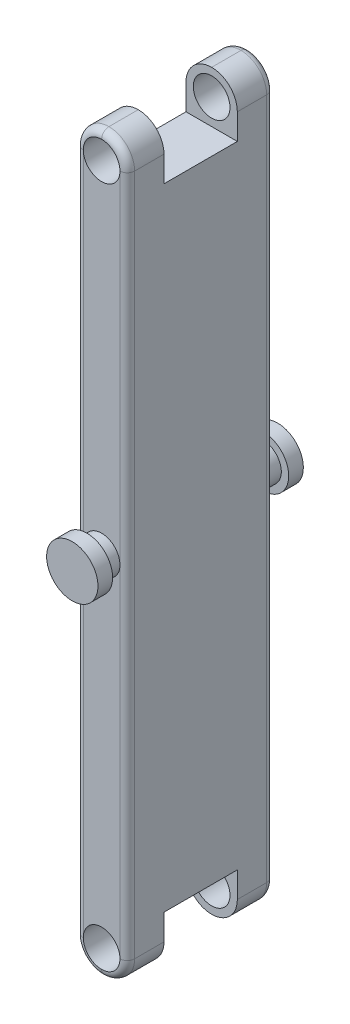
ISO-10303-21;
HEADER;
FILE_DESCRIPTION(('STEP AP214'),'2;1');
FILE_NAME('part.step','',(''),(''),'','','');
FILE_SCHEMA(('AUTOMOTIVE_DESIGN { 1 0 10303 214 1 1 1 1 }'));
ENDSEC;
DATA;
#1=APPLICATION_CONTEXT('core data for automotive mechanical design processes');
#2=APPLICATION_PROTOCOL_DEFINITION('international standard','automotive_design',2000,#1);
#3=PRODUCT_CONTEXT('',#1,'mechanical');
#4=PRODUCT('Part','Part','',(#3));
#5=PRODUCT_RELATED_PRODUCT_CATEGORY('part','',(#4));
#6=PRODUCT_DEFINITION_FORMATION('','',#4);
#7=PRODUCT_DEFINITION_CONTEXT('part definition',#1,'design');
#8=PRODUCT_DEFINITION('design','',#6,#7);
#9=PRODUCT_DEFINITION_SHAPE('','',#8);
#10=(LENGTH_UNIT() NAMED_UNIT(*) SI_UNIT(.MILLI.,.METRE.));
#11=(NAMED_UNIT(*) PLANE_ANGLE_UNIT() SI_UNIT($,.RADIAN.));
#12=(NAMED_UNIT(*) SI_UNIT($,.STERADIAN.) SOLID_ANGLE_UNIT());
#13=UNCERTAINTY_MEASURE_WITH_UNIT(LENGTH_MEASURE(1.E-05),#10,'distance_accuracy_value','');
#14=(GEOMETRIC_REPRESENTATION_CONTEXT(3) GLOBAL_UNCERTAINTY_ASSIGNED_CONTEXT((#13)) GLOBAL_UNIT_ASSIGNED_CONTEXT((#10,
#11,#12)) REPRESENTATION_CONTEXT('',''));
#15=CARTESIAN_POINT('',(0.,0.,0.));
#16=DIRECTION('',(0.,0.,1.));
#17=DIRECTION('',(1.,0.,0.));
#18=AXIS2_PLACEMENT_3D('',#15,#16,#17);
#19=CARTESIAN_POINT('',(0.,200.,20.));
#20=DIRECTION('',(0.,0.,-1.));
#21=DIRECTION('',(-1.,0.,0.));
#22=AXIS2_PLACEMENT_3D('',#19,#20,#21);
#23=PLANE('',#22);
#24=CARTESIAN_POINT('',(7.00000000000001,193.,20.));
#25=DIRECTION('',(0.,0.,-1.));
#26=DIRECTION('',(-1.,0.,0.));
#27=AXIS2_PLACEMENT_3D('',#24,#25,#26);
#28=CIRCLE('',#27,5.);
#29=CARTESIAN_POINT('',(12.,193.,20.));
#30=VERTEX_POINT('',#29);
#31=CARTESIAN_POINT('',(2.00000000000001,193.,20.));
#32=VERTEX_POINT('',#31);
#33=EDGE_CURVE('E253',#30,#32,#28,.T.);
#34=ORIENTED_EDGE('',*,*,#33,.T.);
#35=DIRECTION('',(0.,-1.,0.));
#36=VECTOR('',#35,1.);
#37=CARTESIAN_POINT('',(2.00000000000001,200.,20.));
#38=LINE('',#37,#36);
#39=CARTESIAN_POINT('',(2.00000000000001,100.,20.));
#40=VERTEX_POINT('',#39);
#41=EDGE_CURVE('E367',#32,#40,#38,.T.);
#42=ORIENTED_EDGE('',*,*,#41,.T.);
#43=CARTESIAN_POINT('',(7.00000000000001,100.,20.));
#44=DIRECTION('',(0.,0.,-1.));
#45=DIRECTION('',(-1.,0.,0.));
#46=AXIS2_PLACEMENT_3D('',#43,#44,#45);
#47=CIRCLE('',#46,5.);
#48=CARTESIAN_POINT('',(12.,100.,20.));
#49=VERTEX_POINT('',#48);
#50=EDGE_CURVE('E325',#49,#40,#47,.F.);
#51=ORIENTED_EDGE('',*,*,#50,.F.);
#52=DIRECTION('',(0.,-1.,0.));
#53=VECTOR('',#52,1.);
#54=CARTESIAN_POINT('',(12.,200.,20.));
#55=LINE('',#54,#53);
#56=EDGE_CURVE('E361',#49,#30,#55,.F.);
#57=ORIENTED_EDGE('',*,*,#56,.T.);
#58=EDGE_LOOP('',(#34,#42,#51,#57));
#59=FACE_BOUND('',#58,.T.);
#60=ADVANCED_FACE('F37',(#59),#23,.F.);
#61=CARTESIAN_POINT('',(0.,200.,-20.));
#62=DIRECTION('',(0.,0.,-1.));
#63=DIRECTION('',(-1.,0.,0.));
#64=AXIS2_PLACEMENT_3D('',#61,#62,#63);
#65=PLANE('',#64);
#66=CARTESIAN_POINT('',(7.,7.,-20.));
#67=DIRECTION('',(0.,0.,-1.));
#68=DIRECTION('',(-1.,0.,0.));
#69=AXIS2_PLACEMENT_3D('',#66,#67,#68);
#70=CIRCLE('',#69,5.);
#71=CARTESIAN_POINT('',(1.99999999999999,7.,-20.));
#72=VERTEX_POINT('',#71);
#73=CARTESIAN_POINT('',(12.,7.,-20.));
#74=VERTEX_POINT('',#73);
#75=EDGE_CURVE('E231',#72,#74,#70,.T.);
#76=ORIENTED_EDGE('',*,*,#75,.F.);
#77=DIRECTION('',(0.,-1.,0.));
#78=VECTOR('',#77,1.);
#79=CARTESIAN_POINT('',(1.99999999999999,193.,-20.));
#80=LINE('',#79,#78);
#81=CARTESIAN_POINT('',(1.99999999999999,100.,-20.));
#82=VERTEX_POINT('',#81);
#83=EDGE_CURVE('E350',#72,#82,#80,.F.);
#84=ORIENTED_EDGE('',*,*,#83,.T.);
#85=CARTESIAN_POINT('',(7.00000000000001,100.,-20.));
#86=DIRECTION('',(0.,0.,-1.));
#87=DIRECTION('',(-1.,0.,0.));
#88=AXIS2_PLACEMENT_3D('',#85,#86,#87);
#89=CIRCLE('',#88,5.);
#90=CARTESIAN_POINT('',(12.,100.,-20.));
#91=VERTEX_POINT('',#90);
#92=EDGE_CURVE('E340',#91,#82,#89,.T.);
#93=ORIENTED_EDGE('',*,*,#92,.F.);
#94=DIRECTION('',(0.,-1.,0.));
#95=VECTOR('',#94,1.);
#96=CARTESIAN_POINT('',(12.,7.00000000000001,-20.));
#97=LINE('',#96,#95);
#98=EDGE_CURVE('E344',#91,#74,#97,.T.);
#99=ORIENTED_EDGE('',*,*,#98,.T.);
#100=EDGE_LOOP('',(#76,#84,#93,#99));
#101=FACE_BOUND('',#100,.T.);
#102=ADVANCED_FACE('F497',(#101),#65,.T.);
#103=EDGE_CURVE('E337',#40,#49,#47,.F.);
#104=ORIENTED_EDGE('',*,*,#103,.F.);
#105=DIRECTION('',(0.,-1.,0.));
#106=VECTOR('',#105,1.);
#107=CARTESIAN_POINT('',(2.00000000000001,200.,20.));
#108=LINE('',#107,#106);
#109=CARTESIAN_POINT('',(2.00000000000001,7.,20.));
#110=VERTEX_POINT('',#109);
#111=EDGE_CURVE('E365',#40,#110,#108,.T.);
#112=ORIENTED_EDGE('',*,*,#111,.T.);
#113=CARTESIAN_POINT('',(7.,7.,20.));
#114=DIRECTION('',(0.,0.,-1.));
#115=DIRECTION('',(-1.,0.,0.));
#116=AXIS2_PLACEMENT_3D('',#113,#114,#115);
#117=CIRCLE('',#116,5.);
#118=CARTESIAN_POINT('',(12.,7.,20.));
#119=VERTEX_POINT('',#118);
#120=EDGE_CURVE('E262',#110,#119,#117,.T.);
#121=ORIENTED_EDGE('',*,*,#120,.T.);
#122=DIRECTION('',(0.,-1.,0.));
#123=VECTOR('',#122,1.);
#124=CARTESIAN_POINT('',(12.,200.,20.));
#125=LINE('',#124,#123);
#126=EDGE_CURVE('E363',#119,#49,#125,.F.);
#127=ORIENTED_EDGE('',*,*,#126,.T.);
#128=EDGE_LOOP('',(#104,#112,#121,#127));
#129=FACE_BOUND('',#128,.T.);
#130=ADVANCED_FACE('F500',(#129),#23,.F.);
#131=EDGE_CURVE('E341',#82,#91,#89,.T.);
#132=ORIENTED_EDGE('',*,*,#131,.F.);
#133=DIRECTION('',(0.,-1.,0.));
#134=VECTOR('',#133,1.);
#135=CARTESIAN_POINT('',(1.99999999999999,193.,-20.));
#136=LINE('',#135,#134);
#137=CARTESIAN_POINT('',(1.99999999999999,193.,-20.));
#138=VERTEX_POINT('',#137);
#139=EDGE_CURVE('E348',#82,#138,#136,.F.);
#140=ORIENTED_EDGE('',*,*,#139,.T.);
#141=CARTESIAN_POINT('',(7.00000000000001,193.,-20.));
#142=DIRECTION('',(0.,0.,-1.));
#143=DIRECTION('',(-1.,0.,0.));
#144=AXIS2_PLACEMENT_3D('',#141,#142,#143);
#145=CIRCLE('',#144,5.);
#146=CARTESIAN_POINT('',(12.,193.,-20.));
#147=VERTEX_POINT('',#146);
#148=EDGE_CURVE('E467',#147,#138,#145,.T.);
#149=ORIENTED_EDGE('',*,*,#148,.F.);
#150=DIRECTION('',(0.,-1.,0.));
#151=VECTOR('',#150,1.);
#152=CARTESIAN_POINT('',(12.,7.00000000000001,-20.));
#153=LINE('',#152,#151);
#154=EDGE_CURVE('E346',#147,#91,#153,.T.);
#155=ORIENTED_EDGE('',*,*,#154,.T.);
#156=EDGE_LOOP('',(#132,#140,#149,#155));
#157=FACE_BOUND('',#156,.T.);
#158=ADVANCED_FACE('F469',(#157),#65,.T.);
#159=CARTESIAN_POINT('',(0.,186.,-10.));
#160=DIRECTION('',(0.,0.,1.));
#161=DIRECTION('',(1.,0.,0.));
#162=AXIS2_PLACEMENT_3D('',#159,#160,#161);
#163=PLANE('',#162);
#164=CARTESIAN_POINT('',(7.,193.,-10.));
#165=DIRECTION('',(0.,0.,1.));
#166=DIRECTION('',(1.,0.,0.));
#167=AXIS2_PLACEMENT_3D('',#164,#165,#166);
#168=CIRCLE('',#167,7.);
#169=CARTESIAN_POINT('',(14.,193.,-10.));
#170=VERTEX_POINT('',#169);
#171=CARTESIAN_POINT('',(7.,200.,-10.));
#172=VERTEX_POINT('',#171);
#173=EDGE_CURVE('E312',#170,#172,#168,.T.);
#174=ORIENTED_EDGE('',*,*,#173,.T.);
#175=CARTESIAN_POINT('',(6.99999999999999,193.,-10.));
#176=DIRECTION('',(0.,0.,1.));
#177=DIRECTION('',(1.,0.,0.));
#178=AXIS2_PLACEMENT_3D('',#175,#176,#177);
#179=CIRCLE('',#178,7.);
#180=CARTESIAN_POINT('',(0.,193.,-10.));
#181=VERTEX_POINT('',#180);
#182=EDGE_CURVE('E314',#172,#181,#179,.T.);
#183=ORIENTED_EDGE('',*,*,#182,.T.);
#184=DIRECTION('',(0.,1.,0.));
#185=VECTOR('',#184,1.);
#186=CARTESIAN_POINT('',(0.,186.,-10.));
#187=LINE('',#186,#185);
#188=CARTESIAN_POINT('',(0.,186.,-10.));
#189=VERTEX_POINT('',#188);
#190=EDGE_CURVE('E220',#189,#181,#187,.T.);
#191=ORIENTED_EDGE('',*,*,#190,.F.);
#192=DIRECTION('',(1.,0.,0.));
#193=VECTOR('',#192,1.);
#194=CARTESIAN_POINT('',(0.,186.,-10.));
#195=LINE('',#194,#193);
#196=CARTESIAN_POINT('',(14.,186.,-10.));
#197=VERTEX_POINT('',#196);
#198=EDGE_CURVE('E206',#189,#197,#195,.T.);
#199=ORIENTED_EDGE('',*,*,#198,.T.);
#200=DIRECTION('',(0.,1.,0.));
#201=VECTOR('',#200,1.);
#202=CARTESIAN_POINT('',(14.,186.,-10.));
#203=LINE('',#202,#201);
#204=EDGE_CURVE('E217',#197,#170,#203,.T.);
#205=ORIENTED_EDGE('',*,*,#204,.T.);
#206=EDGE_LOOP('',(#174,#183,#191,#199,#205));
#207=FACE_BOUND('',#206,.T.);
#208=CARTESIAN_POINT('',(7.00000000000001,193.,-10.));
#209=DIRECTION('',(0.,0.,-1.));
#210=DIRECTION('',(-1.,0.,0.));
#211=AXIS2_PLACEMENT_3D('',#208,#209,#210);
#212=CIRCLE('',#211,5.);
#213=CARTESIAN_POINT('',(2.00000000000001,193.,-10.));
#214=VERTEX_POINT('',#213);
#215=EDGE_CURVE('E328',#214,#214,#212,.T.);
#216=ORIENTED_EDGE('',*,*,#215,.T.);
#217=EDGE_LOOP('',(#216));
#218=FACE_BOUND('',#217,.T.);
#219=ADVANCED_FACE('F215',(#207,#218),#163,.T.);
#220=CARTESIAN_POINT('',(0.,200.,0.));
#221=DIRECTION('',(1.,0.,0.));
#222=DIRECTION('',(0.,0.,-1.));
#223=AXIS2_PLACEMENT_3D('',#220,#221,#222);
#224=PLANE('',#223);
#225=DIRECTION('',(0.,0.,-1.));
#226=VECTOR('',#225,1.);
#227=CARTESIAN_POINT('',(0.,193.,-20.));
#228=LINE('',#227,#226);
#229=CARTESIAN_POINT('',(0.,193.,-18.));
#230=VERTEX_POINT('',#229);
#231=EDGE_CURVE('E295',#181,#230,#228,.T.);
#232=ORIENTED_EDGE('',*,*,#231,.T.);
#233=DIRECTION('',(0.,-1.,0.));
#234=VECTOR('',#233,1.);
#235=CARTESIAN_POINT('',(0.,7.00000000000001,-18.));
#236=LINE('',#235,#234);
#237=CARTESIAN_POINT('',(0.,7.00000000000001,-18.));
#238=VERTEX_POINT('',#237);
#239=EDGE_CURVE('E379',#230,#238,#236,.T.);
#240=ORIENTED_EDGE('',*,*,#239,.T.);
#241=DIRECTION('',(0.,0.,-1.));
#242=VECTOR('',#241,1.);
#243=CARTESIAN_POINT('',(0.,7.00000000000001,0.));
#244=LINE('',#243,#242);
#245=CARTESIAN_POINT('',(0.,7.,-10.));
#246=VERTEX_POINT('',#245);
#247=EDGE_CURVE('E293',#238,#246,#244,.F.);
#248=ORIENTED_EDGE('',*,*,#247,.T.);
#249=DIRECTION('',(0.,-1.,0.));
#250=VECTOR('',#249,1.);
#251=CARTESIAN_POINT('',(0.,14.,-10.));
#252=LINE('',#251,#250);
#253=CARTESIAN_POINT('',(0.,14.,-10.));
#254=VERTEX_POINT('',#253);
#255=EDGE_CURVE('E241',#254,#246,#252,.T.);
#256=ORIENTED_EDGE('',*,*,#255,.F.);
#257=DIRECTION('',(0.,0.,-1.));
#258=VECTOR('',#257,1.);
#259=CARTESIAN_POINT('',(0.,14.,0.));
#260=LINE('',#259,#258);
#261=CARTESIAN_POINT('',(0.,14.,10.));
#262=VERTEX_POINT('',#261);
#263=EDGE_CURVE('E265',#262,#254,#260,.T.);
#264=ORIENTED_EDGE('',*,*,#263,.F.);
#265=DIRECTION('',(0.,-1.,0.));
#266=VECTOR('',#265,1.);
#267=CARTESIAN_POINT('',(0.,14.,10.));
#268=LINE('',#267,#266);
#269=CARTESIAN_POINT('',(0.,7.00000000000001,10.));
#270=VERTEX_POINT('',#269);
#271=EDGE_CURVE('E275',#262,#270,#268,.T.);
#272=ORIENTED_EDGE('',*,*,#271,.T.);
#273=DIRECTION('',(0.,0.,1.));
#274=VECTOR('',#273,1.);
#275=CARTESIAN_POINT('',(0.,7.00000000000001,0.));
#276=LINE('',#275,#274);
#277=CARTESIAN_POINT('',(0.,7.00000000000001,18.));
#278=VERTEX_POINT('',#277);
#279=EDGE_CURVE('E278',#270,#278,#276,.T.);
#280=ORIENTED_EDGE('',*,*,#279,.T.);
#281=DIRECTION('',(0.,-1.,0.));
#282=VECTOR('',#281,1.);
#283=CARTESIAN_POINT('',(0.,200.,18.));
#284=LINE('',#283,#282);
#285=CARTESIAN_POINT('',(0.,193.,18.));
#286=VERTEX_POINT('',#285);
#287=EDGE_CURVE('E377',#278,#286,#284,.F.);
#288=ORIENTED_EDGE('',*,*,#287,.T.);
#289=DIRECTION('',(0.,0.,1.));
#290=VECTOR('',#289,1.);
#291=CARTESIAN_POINT('',(0.,193.,10.));
#292=LINE('',#291,#290);
#293=CARTESIAN_POINT('',(0.,193.,10.));
#294=VERTEX_POINT('',#293);
#295=EDGE_CURVE('E298',#286,#294,#292,.F.);
#296=ORIENTED_EDGE('',*,*,#295,.T.);
#297=DIRECTION('',(0.,1.,0.));
#298=VECTOR('',#297,1.);
#299=CARTESIAN_POINT('',(0.,186.,10.));
#300=LINE('',#299,#298);
#301=CARTESIAN_POINT('',(0.,186.,10.));
#302=VERTEX_POINT('',#301);
#303=EDGE_CURVE('E211',#302,#294,#300,.T.);
#304=ORIENTED_EDGE('',*,*,#303,.F.);
#305=DIRECTION('',(0.,0.,1.));
#306=VECTOR('',#305,1.);
#307=CARTESIAN_POINT('',(0.,186.,0.));
#308=LINE('',#307,#306);
#309=EDGE_CURVE('E251',#189,#302,#308,.T.);
#310=ORIENTED_EDGE('',*,*,#309,.F.);
#311=ORIENTED_EDGE('',*,*,#190,.T.);
#312=EDGE_LOOP('',(#232,#240,#248,#256,#264,#272,#280,#288,#296,#304,#310,#311));
#313=FACE_BOUND('',#312,.T.);
#314=ADVANCED_FACE('F429',(#313),#224,.F.);
#315=CARTESIAN_POINT('',(14.,200.,0.));
#316=DIRECTION('',(-1.,0.,0.));
#317=DIRECTION('',(0.,0.,1.));
#318=AXIS2_PLACEMENT_3D('',#315,#316,#317);
#319=PLANE('',#318);
#320=DIRECTION('',(0.,0.,1.));
#321=VECTOR('',#320,1.);
#322=CARTESIAN_POINT('',(14.,7.00000000000001,0.));
#323=LINE('',#322,#321);
#324=CARTESIAN_POINT('',(14.,7.,-10.));
#325=VERTEX_POINT('',#324);
#326=CARTESIAN_POINT('',(14.,7.00000000000001,-18.));
#327=VERTEX_POINT('',#326);
#328=EDGE_CURVE('E307',#325,#327,#323,.F.);
#329=ORIENTED_EDGE('',*,*,#328,.T.);
#330=DIRECTION('',(0.,-1.,0.));
#331=VECTOR('',#330,1.);
#332=CARTESIAN_POINT('',(14.,193.,-18.));
#333=LINE('',#332,#331);
#334=CARTESIAN_POINT('',(14.,193.,-18.));
#335=VERTEX_POINT('',#334);
#336=EDGE_CURVE('E11',#327,#335,#333,.F.);
#337=ORIENTED_EDGE('',*,*,#336,.T.);
#338=DIRECTION('',(0.,0.,1.));
#339=VECTOR('',#338,1.);
#340=CARTESIAN_POINT('',(14.,193.,-10.));
#341=LINE('',#340,#339);
#342=EDGE_CURVE('E226',#335,#170,#341,.T.);
#343=ORIENTED_EDGE('',*,*,#342,.T.);
#344=ORIENTED_EDGE('',*,*,#204,.F.);
#345=DIRECTION('',(0.,0.,-1.));
#346=VECTOR('',#345,1.);
#347=CARTESIAN_POINT('',(14.,186.,0.));
#348=LINE('',#347,#346);
#349=CARTESIAN_POINT('',(14.,186.,10.));
#350=VERTEX_POINT('',#349);
#351=EDGE_CURVE('E202',#350,#197,#348,.T.);
#352=ORIENTED_EDGE('',*,*,#351,.F.);
#353=DIRECTION('',(0.,1.,0.));
#354=VECTOR('',#353,1.);
#355=CARTESIAN_POINT('',(14.,186.,10.));
#356=LINE('',#355,#354);
#357=CARTESIAN_POINT('',(14.,193.,10.));
#358=VERTEX_POINT('',#357);
#359=EDGE_CURVE('E257',#350,#358,#356,.T.);
#360=ORIENTED_EDGE('',*,*,#359,.T.);
#361=DIRECTION('',(0.,0.,-1.));
#362=VECTOR('',#361,1.);
#363=CARTESIAN_POINT('',(14.,193.,20.));
#364=LINE('',#363,#362);
#365=CARTESIAN_POINT('',(14.,193.,18.));
#366=VERTEX_POINT('',#365);
#367=EDGE_CURVE('E310',#358,#366,#364,.F.);
#368=ORIENTED_EDGE('',*,*,#367,.T.);
#369=DIRECTION('',(0.,-1.,0.));
#370=VECTOR('',#369,1.);
#371=CARTESIAN_POINT('',(14.,200.,18.));
#372=LINE('',#371,#370);
#373=CARTESIAN_POINT('',(14.,7.00000000000001,18.));
#374=VERTEX_POINT('',#373);
#375=EDGE_CURVE('E46',#366,#374,#372,.T.);
#376=ORIENTED_EDGE('',*,*,#375,.T.);
#377=DIRECTION('',(0.,0.,-1.));
#378=VECTOR('',#377,1.);
#379=CARTESIAN_POINT('',(14.,7.00000000000001,0.));
#380=LINE('',#379,#378);
#381=CARTESIAN_POINT('',(14.,7.00000000000001,10.));
#382=VERTEX_POINT('',#381);
#383=EDGE_CURVE('E305',#374,#382,#380,.T.);
#384=ORIENTED_EDGE('',*,*,#383,.T.);
#385=DIRECTION('',(0.,-1.,0.));
#386=VECTOR('',#385,1.);
#387=CARTESIAN_POINT('',(14.,14.,10.));
#388=LINE('',#387,#386);
#389=CARTESIAN_POINT('',(14.,14.,10.));
#390=VERTEX_POINT('',#389);
#391=EDGE_CURVE('E273',#390,#382,#388,.T.);
#392=ORIENTED_EDGE('',*,*,#391,.F.);
#393=DIRECTION('',(0.,0.,1.));
#394=VECTOR('',#393,1.);
#395=CARTESIAN_POINT('',(14.,14.,0.));
#396=LINE('',#395,#394);
#397=CARTESIAN_POINT('',(14.,14.,-10.));
#398=VERTEX_POINT('',#397);
#399=EDGE_CURVE('E274',#398,#390,#396,.T.);
#400=ORIENTED_EDGE('',*,*,#399,.F.);
#401=DIRECTION('',(0.,-1.,0.));
#402=VECTOR('',#401,1.);
#403=CARTESIAN_POINT('',(14.,14.,-10.));
#404=LINE('',#403,#402);
#405=EDGE_CURVE('E242',#398,#325,#404,.T.);
#406=ORIENTED_EDGE('',*,*,#405,.T.);
#407=EDGE_LOOP('',(#329,#337,#343,#344,#352,#360,#368,#376,#384,#392,#400,#406));
#408=FACE_BOUND('',#407,.T.);
#409=ADVANCED_FACE('F224',(#408),#319,.F.);
#410=CARTESIAN_POINT('',(0.,14.,-10.));
#411=DIRECTION('',(0.,0.,1.));
#412=DIRECTION('',(1.,0.,0.));
#413=AXIS2_PLACEMENT_3D('',#410,#411,#412);
#414=PLANE('',#413);
#415=ORIENTED_EDGE('',*,*,#255,.T.);
#416=CARTESIAN_POINT('',(6.99999999999999,7.,-10.));
#417=DIRECTION('',(0.,0.,1.));
#418=DIRECTION('',(1.,0.,0.));
#419=AXIS2_PLACEMENT_3D('',#416,#417,#418);
#420=CIRCLE('',#419,7.);
#421=CARTESIAN_POINT('',(7.,0.,-10.));
#422=VERTEX_POINT('',#421);
#423=EDGE_CURVE('E318',#246,#422,#420,.T.);
#424=ORIENTED_EDGE('',*,*,#423,.T.);
#425=CARTESIAN_POINT('',(7.,7.,-10.));
#426=DIRECTION('',(0.,0.,1.));
#427=DIRECTION('',(1.,0.,0.));
#428=AXIS2_PLACEMENT_3D('',#425,#426,#427);
#429=CIRCLE('',#428,7.);
#430=EDGE_CURVE('E316',#422,#325,#429,.T.);
#431=ORIENTED_EDGE('',*,*,#430,.T.);
#432=ORIENTED_EDGE('',*,*,#405,.F.);
#433=DIRECTION('',(-1.,0.,0.));
#434=VECTOR('',#433,1.);
#435=CARTESIAN_POINT('',(0.,14.,-10.));
#436=LINE('',#435,#434);
#437=EDGE_CURVE('E234',#398,#254,#436,.T.);
#438=ORIENTED_EDGE('',*,*,#437,.T.);
#439=EDGE_LOOP('',(#415,#424,#431,#432,#438));
#440=FACE_BOUND('',#439,.T.);
#441=CARTESIAN_POINT('',(7.00000000000001,7.,-10.));
#442=DIRECTION('',(0.,0.,-1.));
#443=DIRECTION('',(-1.,0.,0.));
#444=AXIS2_PLACEMENT_3D('',#441,#442,#443);
#445=CIRCLE('',#444,5.);
#446=CARTESIAN_POINT('',(2.00000000000001,7.,-10.));
#447=VERTEX_POINT('',#446);
#448=EDGE_CURVE('E228',#447,#447,#445,.T.);
#449=ORIENTED_EDGE('',*,*,#448,.T.);
#450=EDGE_LOOP('',(#449));
#451=FACE_BOUND('',#450,.T.);
#452=ADVANCED_FACE('F557',(#440,#451),#414,.T.);
#453=CARTESIAN_POINT('',(0.,14.,10.));
#454=DIRECTION('',(0.,0.,1.));
#455=DIRECTION('',(1.,0.,0.));
#456=AXIS2_PLACEMENT_3D('',#453,#454,#455);
#457=PLANE('',#456);
#458=CARTESIAN_POINT('',(7.00000000000001,7.,10.));
#459=DIRECTION('',(0.,0.,-1.));
#460=DIRECTION('',(-1.,0.,0.));
#461=AXIS2_PLACEMENT_3D('',#458,#459,#460);
#462=CIRCLE('',#461,5.);
#463=CARTESIAN_POINT('',(2.00000000000001,7.,10.));
#464=VERTEX_POINT('',#463);
#465=EDGE_CURVE('E259',#464,#464,#462,.T.);
#466=ORIENTED_EDGE('',*,*,#465,.F.);
#467=EDGE_LOOP('',(#466));
#468=FACE_BOUND('',#467,.T.);
#469=CARTESIAN_POINT('',(7.00000000000001,7.00000000000001,10.));
#470=DIRECTION('',(0.,0.,1.));
#471=DIRECTION('',(1.,0.,0.));
#472=AXIS2_PLACEMENT_3D('',#469,#470,#471);
#473=CIRCLE('',#472,7.);
#474=CARTESIAN_POINT('',(7.00000000000001,0.,10.));
#475=VERTEX_POINT('',#474);
#476=EDGE_CURVE('E321',#382,#475,#473,.F.);
#477=ORIENTED_EDGE('',*,*,#476,.T.);
#478=CARTESIAN_POINT('',(7.00000000000001,7.00000000000001,10.));
#479=DIRECTION('',(0.,0.,1.));
#480=DIRECTION('',(1.,0.,0.));
#481=AXIS2_PLACEMENT_3D('',#478,#479,#480);
#482=CIRCLE('',#481,7.);
#483=EDGE_CURVE('E323',#475,#270,#482,.F.);
#484=ORIENTED_EDGE('',*,*,#483,.T.);
#485=ORIENTED_EDGE('',*,*,#271,.F.);
#486=DIRECTION('',(-1.,0.,0.));
#487=VECTOR('',#486,1.);
#488=CARTESIAN_POINT('',(0.,14.,10.));
#489=LINE('',#488,#487);
#490=EDGE_CURVE('E270',#390,#262,#489,.T.);
#491=ORIENTED_EDGE('',*,*,#490,.F.);
#492=ORIENTED_EDGE('',*,*,#391,.T.);
#493=EDGE_LOOP('',(#477,#484,#485,#491,#492));
#494=FACE_BOUND('',#493,.T.);
#495=ADVANCED_FACE('F554',(#468,#494),#457,.F.);
#496=CARTESIAN_POINT('',(0.,14.,0.));
#497=DIRECTION('',(0.,1.,0.));
#498=DIRECTION('',(0.,0.,1.));
#499=AXIS2_PLACEMENT_3D('',#496,#497,#498);
#500=PLANE('',#499);
#501=ORIENTED_EDGE('',*,*,#263,.T.);
#502=ORIENTED_EDGE('',*,*,#437,.F.);
#503=ORIENTED_EDGE('',*,*,#399,.T.);
#504=ORIENTED_EDGE('',*,*,#490,.T.);
#505=EDGE_LOOP('',(#501,#502,#503,#504));
#506=FACE_BOUND('',#505,.T.);
#507=ADVANCED_FACE('F548',(#506),#500,.F.);
#508=CARTESIAN_POINT('',(7.,7.,20.));
#509=DIRECTION('',(0.,0.,-1.));
#510=DIRECTION('',(-1.,0.,0.));
#511=AXIS2_PLACEMENT_3D('',#508,#509,#510);
#512=CYLINDRICAL_SURFACE('',#511,5.);
#513=ORIENTED_EDGE('',*,*,#120,.F.);
#514=CARTESIAN_POINT('',(7.00000000000001,2.,20.));
#515=VERTEX_POINT('',#514);
#516=EDGE_CURVE('E267',#515,#110,#117,.T.);
#517=ORIENTED_EDGE('',*,*,#516,.F.);
#518=EDGE_CURVE('E266',#119,#515,#117,.T.);
#519=ORIENTED_EDGE('',*,*,#518,.F.);
#520=EDGE_LOOP('',(#513,#517,#519));
#521=FACE_BOUND('',#520,.T.);
#522=ORIENTED_EDGE('',*,*,#465,.T.);
#523=EDGE_LOOP('',(#522));
#524=FACE_BOUND('',#523,.T.);
#525=ADVANCED_FACE('F541',(#521,#524),#512,.F.);
#526=CARTESIAN_POINT('',(0.,186.,10.));
#527=DIRECTION('',(0.,0.,1.));
#528=DIRECTION('',(1.,0.,0.));
#529=AXIS2_PLACEMENT_3D('',#526,#527,#528);
#530=PLANE('',#529);
#531=CARTESIAN_POINT('',(7.00000000000001,193.,10.));
#532=DIRECTION('',(0.,0.,-1.));
#533=DIRECTION('',(-1.,0.,0.));
#534=AXIS2_PLACEMENT_3D('',#531,#532,#533);
#535=CIRCLE('',#534,5.);
#536=CARTESIAN_POINT('',(2.00000000000001,193.,10.));
#537=VERTEX_POINT('',#536);
#538=EDGE_CURVE('E245',#537,#537,#535,.T.);
#539=ORIENTED_EDGE('',*,*,#538,.F.);
#540=EDGE_LOOP('',(#539));
#541=FACE_BOUND('',#540,.T.);
#542=ORIENTED_EDGE('',*,*,#303,.T.);
#543=CARTESIAN_POINT('',(7.00000000000001,193.,10.));
#544=DIRECTION('',(0.,0.,1.));
#545=DIRECTION('',(1.,0.,0.));
#546=AXIS2_PLACEMENT_3D('',#543,#544,#545);
#547=CIRCLE('',#546,7.);
#548=CARTESIAN_POINT('',(7.00000000000001,200.,10.));
#549=VERTEX_POINT('',#548);
#550=EDGE_CURVE('E302',#294,#549,#547,.F.);
#551=ORIENTED_EDGE('',*,*,#550,.T.);
#552=CARTESIAN_POINT('',(7.00000000000001,193.,10.));
#553=DIRECTION('',(0.,0.,1.));
#554=DIRECTION('',(1.,0.,0.));
#555=AXIS2_PLACEMENT_3D('',#552,#553,#554);
#556=CIRCLE('',#555,7.);
#557=EDGE_CURVE('E300',#549,#358,#556,.F.);
#558=ORIENTED_EDGE('',*,*,#557,.T.);
#559=ORIENTED_EDGE('',*,*,#359,.F.);
#560=DIRECTION('',(1.,0.,0.));
#561=VECTOR('',#560,1.);
#562=CARTESIAN_POINT('',(0.,186.,10.));
#563=LINE('',#562,#561);
#564=EDGE_CURVE('E208',#302,#350,#563,.T.);
#565=ORIENTED_EDGE('',*,*,#564,.F.);
#566=EDGE_LOOP('',(#542,#551,#558,#559,#565));
#567=FACE_BOUND('',#566,.T.);
#568=ADVANCED_FACE('F437',(#541,#567),#530,.F.);
#569=CARTESIAN_POINT('',(0.,186.,0.));
#570=DIRECTION('',(0.,1.,0.));
#571=DIRECTION('',(0.,0.,1.));
#572=AXIS2_PLACEMENT_3D('',#569,#570,#571);
#573=PLANE('',#572);
#574=ORIENTED_EDGE('',*,*,#309,.T.);
#575=ORIENTED_EDGE('',*,*,#564,.T.);
#576=ORIENTED_EDGE('',*,*,#351,.T.);
#577=ORIENTED_EDGE('',*,*,#198,.F.);
#578=EDGE_LOOP('',(#574,#575,#576,#577));
#579=FACE_BOUND('',#578,.T.);
#580=ADVANCED_FACE('F205',(#579),#573,.T.);
#581=CARTESIAN_POINT('',(7.00000000000001,193.,20.));
#582=DIRECTION('',(0.,0.,-1.));
#583=DIRECTION('',(-1.,0.,0.));
#584=AXIS2_PLACEMENT_3D('',#581,#582,#583);
#585=CYLINDRICAL_SURFACE('',#584,5.);
#586=CARTESIAN_POINT('',(7.00000000000001,198.,20.));
#587=VERTEX_POINT('',#586);
#588=EDGE_CURVE('E248',#32,#587,#28,.T.);
#589=ORIENTED_EDGE('',*,*,#588,.F.);
#590=ORIENTED_EDGE('',*,*,#33,.F.);
#591=EDGE_CURVE('E252',#587,#30,#28,.T.);
#592=ORIENTED_EDGE('',*,*,#591,.F.);
#593=EDGE_LOOP('',(#589,#590,#592));
#594=FACE_BOUND('',#593,.T.);
#595=ORIENTED_EDGE('',*,*,#538,.T.);
#596=EDGE_LOOP('',(#595));
#597=FACE_BOUND('',#596,.T.);
#598=ADVANCED_FACE('F491',(#594,#597),#585,.F.);
#599=CARTESIAN_POINT('',(7.,7.,-20.));
#600=DIRECTION('',(0.,0.,1.));
#601=DIRECTION('',(1.,0.,0.));
#602=AXIS2_PLACEMENT_3D('',#599,#600,#601);
#603=CYLINDRICAL_SURFACE('',#602,5.);
#604=ORIENTED_EDGE('',*,*,#75,.T.);
#605=CARTESIAN_POINT('',(7.,2.,-20.));
#606=VERTEX_POINT('',#605);
#607=EDGE_CURVE('E235',#74,#606,#70,.T.);
#608=ORIENTED_EDGE('',*,*,#607,.T.);
#609=EDGE_CURVE('E236',#606,#72,#70,.T.);
#610=ORIENTED_EDGE('',*,*,#609,.T.);
#611=EDGE_LOOP('',(#604,#608,#610));
#612=FACE_BOUND('',#611,.T.);
#613=ORIENTED_EDGE('',*,*,#448,.F.);
#614=EDGE_LOOP('',(#613));
#615=FACE_BOUND('',#614,.T.);
#616=ADVANCED_FACE('F483',(#612,#615),#603,.F.);
#617=CARTESIAN_POINT('',(7.00000000000001,193.,-20.));
#618=DIRECTION('',(0.,0.,1.));
#619=DIRECTION('',(1.,0.,0.));
#620=AXIS2_PLACEMENT_3D('',#617,#618,#619);
#621=CYLINDRICAL_SURFACE('',#620,5.);
#622=CARTESIAN_POINT('',(7.,198.,-20.));
#623=VERTEX_POINT('',#622);
#624=EDGE_CURVE('E221',#138,#623,#145,.T.);
#625=ORIENTED_EDGE('',*,*,#624,.T.);
#626=EDGE_CURVE('E472',#623,#147,#145,.T.);
#627=ORIENTED_EDGE('',*,*,#626,.T.);
#628=ORIENTED_EDGE('',*,*,#148,.T.);
#629=EDGE_LOOP('',(#625,#627,#628));
#630=FACE_BOUND('',#629,.T.);
#631=ORIENTED_EDGE('',*,*,#215,.F.);
#632=EDGE_LOOP('',(#631));
#633=FACE_BOUND('',#632,.T.);
#634=ADVANCED_FACE('F474',(#630,#633),#621,.F.);
#635=CARTESIAN_POINT('',(7.00000000000001,193.,0.));
#636=DIRECTION('',(0.,0.,1.));
#637=DIRECTION('',(1.,0.,0.));
#638=AXIS2_PLACEMENT_3D('',#635,#636,#637);
#639=CYLINDRICAL_SURFACE('',#638,7.);
#640=DIRECTION('',(0.,0.,-1.));
#641=VECTOR('',#640,1.);
#642=CARTESIAN_POINT('',(7.00000000000001,200.,10.));
#643=LINE('',#642,#641);
#644=CARTESIAN_POINT('',(7.00000000000001,200.,18.));
#645=VERTEX_POINT('',#644);
#646=EDGE_CURVE('E326',#645,#549,#643,.T.);
#647=ORIENTED_EDGE('',*,*,#646,.F.);
#648=CARTESIAN_POINT('',(7.00000000000001,193.,18.));
#649=DIRECTION('',(0.,0.,-1.));
#650=DIRECTION('',(-1.,0.,0.));
#651=AXIS2_PLACEMENT_3D('',#648,#649,#650);
#652=CIRCLE('',#651,7.);
#653=EDGE_CURVE('E369',#645,#366,#652,.T.);
#654=ORIENTED_EDGE('',*,*,#653,.T.);
#655=ORIENTED_EDGE('',*,*,#367,.F.);
#656=ORIENTED_EDGE('',*,*,#557,.F.);
#657=EDGE_LOOP('',(#647,#654,#655,#656));
#658=FACE_BOUND('',#657,.T.);
#659=ADVANCED_FACE('F482',(#658),#639,.T.);
#660=CARTESIAN_POINT('',(7.,193.,0.));
#661=DIRECTION('',(0.,0.,-1.));
#662=DIRECTION('',(-1.,0.,0.));
#663=AXIS2_PLACEMENT_3D('',#660,#661,#662);
#664=CYLINDRICAL_SURFACE('',#663,7.);
#665=ORIENTED_EDGE('',*,*,#295,.F.);
#666=CARTESIAN_POINT('',(7.00000000000001,193.,18.));
#667=DIRECTION('',(0.,0.,-1.));
#668=DIRECTION('',(-1.,0.,0.));
#669=AXIS2_PLACEMENT_3D('',#666,#667,#668);
#670=CIRCLE('',#669,7.);
#671=EDGE_CURVE('E372',#286,#645,#670,.T.);
#672=ORIENTED_EDGE('',*,*,#671,.T.);
#673=ORIENTED_EDGE('',*,*,#646,.T.);
#674=ORIENTED_EDGE('',*,*,#550,.F.);
#675=EDGE_LOOP('',(#665,#672,#673,#674));
#676=FACE_BOUND('',#675,.T.);
#677=ADVANCED_FACE('F433',(#676),#664,.T.);
#678=CARTESIAN_POINT('',(7.00000000000001,193.,0.));
#679=DIRECTION('',(0.,0.,-1.));
#680=DIRECTION('',(-1.,0.,0.));
#681=AXIS2_PLACEMENT_3D('',#678,#679,#680);
#682=CYLINDRICAL_SURFACE('',#681,7.);
#683=ORIENTED_EDGE('',*,*,#342,.F.);
#684=CARTESIAN_POINT('',(7.,193.,-18.));
#685=DIRECTION('',(0.,0.,-1.));
#686=DIRECTION('',(-1.,0.,0.));
#687=AXIS2_PLACEMENT_3D('',#684,#685,#686);
#688=CIRCLE('',#687,7.);
#689=CARTESIAN_POINT('',(7.,200.,-18.));
#690=VERTEX_POINT('',#689);
#691=EDGE_CURVE('E352',#335,#690,#688,.F.);
#692=ORIENTED_EDGE('',*,*,#691,.T.);
#693=DIRECTION('',(0.,0.,1.));
#694=VECTOR('',#693,1.);
#695=CARTESIAN_POINT('',(7.,200.,-20.));
#696=LINE('',#695,#694);
#697=EDGE_CURVE('E329',#172,#690,#696,.F.);
#698=ORIENTED_EDGE('',*,*,#697,.F.);
#699=ORIENTED_EDGE('',*,*,#173,.F.);
#700=EDGE_LOOP('',(#683,#692,#698,#699));
#701=FACE_BOUND('',#700,.T.);
#702=ADVANCED_FACE('F453',(#701),#682,.T.);
#703=CARTESIAN_POINT('',(7.,193.,0.));
#704=DIRECTION('',(0.,0.,1.));
#705=DIRECTION('',(1.,0.,0.));
#706=AXIS2_PLACEMENT_3D('',#703,#704,#705);
#707=CYLINDRICAL_SURFACE('',#706,7.);
#708=ORIENTED_EDGE('',*,*,#697,.T.);
#709=CARTESIAN_POINT('',(6.99999999999999,193.,-18.));
#710=DIRECTION('',(0.,0.,-1.));
#711=DIRECTION('',(-1.,0.,0.));
#712=AXIS2_PLACEMENT_3D('',#709,#710,#711);
#713=CIRCLE('',#712,7.);
#714=EDGE_CURVE('E355',#690,#230,#713,.F.);
#715=ORIENTED_EDGE('',*,*,#714,.T.);
#716=ORIENTED_EDGE('',*,*,#231,.F.);
#717=ORIENTED_EDGE('',*,*,#182,.F.);
#718=EDGE_LOOP('',(#708,#715,#716,#717));
#719=FACE_BOUND('',#718,.T.);
#720=ADVANCED_FACE('F442',(#719),#707,.T.);
#721=CARTESIAN_POINT('',(7.00000000000001,7.,0.));
#722=DIRECTION('',(0.,0.,1.));
#723=DIRECTION('',(1.,0.,0.));
#724=AXIS2_PLACEMENT_3D('',#721,#722,#723);
#725=CYLINDRICAL_SURFACE('',#724,7.);
#726=DIRECTION('',(0.,0.,1.));
#727=VECTOR('',#726,1.);
#728=CARTESIAN_POINT('',(7.00000000000001,0.,0.));
#729=LINE('',#728,#727);
#730=CARTESIAN_POINT('',(7.,0.,-18.));
#731=VERTEX_POINT('',#730);
#732=EDGE_CURVE('E332',#731,#422,#729,.T.);
#733=ORIENTED_EDGE('',*,*,#732,.F.);
#734=CARTESIAN_POINT('',(7.,7.,-18.));
#735=DIRECTION('',(0.,0.,-1.));
#736=DIRECTION('',(-1.,0.,0.));
#737=AXIS2_PLACEMENT_3D('',#734,#735,#736);
#738=CIRCLE('',#737,7.);
#739=EDGE_CURVE('E359',#731,#327,#738,.F.);
#740=ORIENTED_EDGE('',*,*,#739,.T.);
#741=ORIENTED_EDGE('',*,*,#328,.F.);
#742=ORIENTED_EDGE('',*,*,#430,.F.);
#743=EDGE_LOOP('',(#733,#740,#741,#742));
#744=FACE_BOUND('',#743,.T.);
#745=ADVANCED_FACE('F574',(#744),#725,.T.);
#746=CARTESIAN_POINT('',(7.,7.,0.));
#747=DIRECTION('',(0.,0.,-1.));
#748=DIRECTION('',(-1.,0.,0.));
#749=AXIS2_PLACEMENT_3D('',#746,#747,#748);
#750=CYLINDRICAL_SURFACE('',#749,7.);
#751=ORIENTED_EDGE('',*,*,#247,.F.);
#752=CARTESIAN_POINT('',(6.99999999999999,7.,-18.));
#753=DIRECTION('',(0.,0.,-1.));
#754=DIRECTION('',(-1.,0.,0.));
#755=AXIS2_PLACEMENT_3D('',#752,#753,#754);
#756=CIRCLE('',#755,7.);
#757=EDGE_CURVE('E357',#238,#731,#756,.F.);
#758=ORIENTED_EDGE('',*,*,#757,.T.);
#759=ORIENTED_EDGE('',*,*,#732,.T.);
#760=ORIENTED_EDGE('',*,*,#423,.F.);
#761=EDGE_LOOP('',(#751,#758,#759,#760));
#762=FACE_BOUND('',#761,.T.);
#763=ADVANCED_FACE('F577',(#762),#750,.T.);
#764=CARTESIAN_POINT('',(7.00000000000001,7.00000000000001,0.));
#765=DIRECTION('',(0.,0.,-1.));
#766=DIRECTION('',(-1.,0.,0.));
#767=AXIS2_PLACEMENT_3D('',#764,#765,#766);
#768=CYLINDRICAL_SURFACE('',#767,7.);
#769=ORIENTED_EDGE('',*,*,#383,.F.);
#770=CARTESIAN_POINT('',(7.00000000000001,7.00000000000001,18.));
#771=DIRECTION('',(0.,0.,-1.));
#772=DIRECTION('',(-1.,0.,0.));
#773=AXIS2_PLACEMENT_3D('',#770,#771,#772);
#774=CIRCLE('',#773,7.);
#775=CARTESIAN_POINT('',(7.00000000000001,0.,18.));
#776=VERTEX_POINT('',#775);
#777=EDGE_CURVE('E375',#374,#776,#774,.T.);
#778=ORIENTED_EDGE('',*,*,#777,.T.);
#779=DIRECTION('',(0.,0.,-1.));
#780=VECTOR('',#779,1.);
#781=CARTESIAN_POINT('',(7.00000000000001,0.,0.));
#782=LINE('',#781,#780);
#783=EDGE_CURVE('E334',#475,#776,#782,.F.);
#784=ORIENTED_EDGE('',*,*,#783,.F.);
#785=ORIENTED_EDGE('',*,*,#476,.F.);
#786=EDGE_LOOP('',(#769,#778,#784,#785));
#787=FACE_BOUND('',#786,.T.);
#788=ADVANCED_FACE('F580',(#787),#768,.T.);
#789=CARTESIAN_POINT('',(7.,7.00000000000001,0.));
#790=DIRECTION('',(0.,0.,1.));
#791=DIRECTION('',(1.,0.,0.));
#792=AXIS2_PLACEMENT_3D('',#789,#790,#791);
#793=CYLINDRICAL_SURFACE('',#792,7.);
#794=ORIENTED_EDGE('',*,*,#783,.T.);
#795=CARTESIAN_POINT('',(7.00000000000001,7.00000000000001,18.));
#796=DIRECTION('',(0.,0.,-1.));
#797=DIRECTION('',(-1.,0.,0.));
#798=AXIS2_PLACEMENT_3D('',#795,#796,#797);
#799=CIRCLE('',#798,7.);
#800=EDGE_CURVE('E61',#776,#278,#799,.T.);
#801=ORIENTED_EDGE('',*,*,#800,.T.);
#802=ORIENTED_EDGE('',*,*,#279,.F.);
#803=ORIENTED_EDGE('',*,*,#483,.F.);
#804=EDGE_LOOP('',(#794,#801,#802,#803));
#805=FACE_BOUND('',#804,.T.);
#806=ADVANCED_FACE('F585',(#805),#793,.T.);
#807=CARTESIAN_POINT('',(7.00000000000001,100.,24.));
#808=DIRECTION('',(0.,0.,-1.));
#809=DIRECTION('',(-1.,0.,0.));
#810=AXIS2_PLACEMENT_3D('',#807,#808,#809);
#811=CYLINDRICAL_SURFACE('',#810,5.);
#812=CARTESIAN_POINT('',(7.00000000000001,100.,24.));
#813=DIRECTION('',(0.,0.,1.));
#814=DIRECTION('',(1.,0.,0.));
#815=AXIS2_PLACEMENT_3D('',#812,#813,#814);
#816=CIRCLE('',#815,5.);
#817=CARTESIAN_POINT('',(12.,100.,24.));
#818=VERTEX_POINT('',#817);
#819=EDGE_CURVE('E336',#818,#818,#816,.T.);
#820=ORIENTED_EDGE('',*,*,#819,.F.);
#821=EDGE_LOOP('',(#820));
#822=FACE_BOUND('',#821,.T.);
#823=ORIENTED_EDGE('',*,*,#103,.T.);
#824=ORIENTED_EDGE('',*,*,#50,.T.);
#825=EDGE_LOOP('',(#823,#824));
#826=FACE_BOUND('',#825,.T.);
#827=ADVANCED_FACE('F588',(#822,#826),#811,.T.);
#828=CARTESIAN_POINT('',(7.00000000000001,100.,24.));
#829=DIRECTION('',(0.,0.,1.));
#830=DIRECTION('',(1.,0.,0.));
#831=AXIS2_PLACEMENT_3D('',#828,#829,#830);
#832=PLANE('',#831);
#833=CARTESIAN_POINT('',(7.00000000000001,100.,24.));
#834=DIRECTION('',(0.,0.,1.));
#835=DIRECTION('',(1.,0.,0.));
#836=AXIS2_PLACEMENT_3D('',#833,#834,#835);
#837=CIRCLE('',#836,7.);
#838=CARTESIAN_POINT('',(14.,100.,24.));
#839=VERTEX_POINT('',#838);
#840=EDGE_CURVE('E958',#839,#839,#837,.T.);
#841=ORIENTED_EDGE('',*,*,#840,.F.);
#842=EDGE_LOOP('',(#841));
#843=FACE_BOUND('',#842,.T.);
#844=ORIENTED_EDGE('',*,*,#819,.T.);
#845=EDGE_LOOP('',(#844));
#846=FACE_BOUND('',#845,.T.);
#847=ADVANCED_FACE('F695',(#843,#846),#832,.F.);
#848=CARTESIAN_POINT('',(7.00000000000001,100.,28.));
#849=DIRECTION('',(0.,0.,-1.));
#850=DIRECTION('',(-1.,0.,0.));
#851=AXIS2_PLACEMENT_3D('',#848,#849,#850);
#852=CYLINDRICAL_SURFACE('',#851,7.);
#853=CARTESIAN_POINT('',(7.00000000000001,100.,28.));
#854=DIRECTION('',(0.,0.,1.));
#855=DIRECTION('',(1.,0.,0.));
#856=AXIS2_PLACEMENT_3D('',#853,#854,#855);
#857=CIRCLE('',#856,7.);
#858=CARTESIAN_POINT('',(14.,100.,28.));
#859=VERTEX_POINT('',#858);
#860=EDGE_CURVE('E956',#859,#859,#857,.T.);
#861=ORIENTED_EDGE('',*,*,#860,.F.);
#862=EDGE_LOOP('',(#861));
#863=FACE_BOUND('',#862,.T.);
#864=ORIENTED_EDGE('',*,*,#840,.T.);
#865=EDGE_LOOP('',(#864));
#866=FACE_BOUND('',#865,.T.);
#867=ADVANCED_FACE('F687',(#863,#866),#852,.T.);
#868=CARTESIAN_POINT('',(7.00000000000001,100.,28.));
#869=DIRECTION('',(0.,0.,1.));
#870=DIRECTION('',(1.,0.,0.));
#871=AXIS2_PLACEMENT_3D('',#868,#869,#870);
#872=PLANE('',#871);
#873=ORIENTED_EDGE('',*,*,#860,.T.);
#874=EDGE_LOOP('',(#873));
#875=FACE_BOUND('',#874,.T.);
#876=ADVANCED_FACE('F679',(#875),#872,.T.);
#877=CARTESIAN_POINT('',(7.00000000000001,100.,-24.));
#878=DIRECTION('',(0.,0.,1.));
#879=DIRECTION('',(1.,0.,0.));
#880=AXIS2_PLACEMENT_3D('',#877,#878,#879);
#881=CYLINDRICAL_SURFACE('',#880,5.);
#882=CARTESIAN_POINT('',(7.00000000000001,100.,-24.));
#883=DIRECTION('',(0.,0.,-1.));
#884=DIRECTION('',(-1.,0.,0.));
#885=AXIS2_PLACEMENT_3D('',#882,#883,#884);
#886=CIRCLE('',#885,5.);
#887=CARTESIAN_POINT('',(2.00000000000001,100.,-24.));
#888=VERTEX_POINT('',#887);
#889=EDGE_CURVE('E962',#888,#888,#886,.F.);
#890=ORIENTED_EDGE('',*,*,#889,.T.);
#891=EDGE_LOOP('',(#890));
#892=FACE_BOUND('',#891,.T.);
#893=ORIENTED_EDGE('',*,*,#131,.T.);
#894=ORIENTED_EDGE('',*,*,#92,.T.);
#895=EDGE_LOOP('',(#893,#894));
#896=FACE_BOUND('',#895,.T.);
#897=ADVANCED_FACE('F671',(#892,#896),#881,.T.);
#898=CARTESIAN_POINT('',(7.00000000000001,100.,-28.));
#899=DIRECTION('',(0.,0.,1.));
#900=DIRECTION('',(1.,0.,0.));
#901=AXIS2_PLACEMENT_3D('',#898,#899,#900);
#902=CYLINDRICAL_SURFACE('',#901,7.);
#903=CARTESIAN_POINT('',(7.00000000000001,100.,-28.));
#904=DIRECTION('',(0.,0.,1.));
#905=DIRECTION('',(1.,0.,0.));
#906=AXIS2_PLACEMENT_3D('',#903,#904,#905);
#907=CIRCLE('',#906,7.);
#908=CARTESIAN_POINT('',(14.,100.,-28.));
#909=VERTEX_POINT('',#908);
#910=EDGE_CURVE('E966',#909,#909,#907,.T.);
#911=ORIENTED_EDGE('',*,*,#910,.T.);
#912=EDGE_LOOP('',(#911));
#913=FACE_BOUND('',#912,.T.);
#914=CARTESIAN_POINT('',(7.00000000000001,100.,-24.));
#915=DIRECTION('',(0.,0.,1.));
#916=DIRECTION('',(1.,0.,0.));
#917=AXIS2_PLACEMENT_3D('',#914,#915,#916);
#918=CIRCLE('',#917,7.);
#919=CARTESIAN_POINT('',(14.,100.,-24.));
#920=VERTEX_POINT('',#919);
#921=EDGE_CURVE('E398',#920,#920,#918,.T.);
#922=ORIENTED_EDGE('',*,*,#921,.F.);
#923=EDGE_LOOP('',(#922));
#924=FACE_BOUND('',#923,.T.);
#925=ADVANCED_FACE('F663',(#913,#924),#902,.T.);
#926=CARTESIAN_POINT('',(7.00000000000001,100.,-28.));
#927=DIRECTION('',(0.,0.,-1.));
#928=DIRECTION('',(1.,0.,0.));
#929=AXIS2_PLACEMENT_3D('',#926,#927,#928);
#930=PLANE('',#929);
#931=ORIENTED_EDGE('',*,*,#910,.F.);
#932=EDGE_LOOP('',(#931));
#933=FACE_BOUND('',#932,.T.);
#934=ADVANCED_FACE('F655',(#933),#930,.T.);
#935=CARTESIAN_POINT('',(7.00000000000001,100.,-24.));
#936=DIRECTION('',(0.,0.,-1.));
#937=DIRECTION('',(1.,0.,0.));
#938=AXIS2_PLACEMENT_3D('',#935,#936,#937);
#939=PLANE('',#938);
#940=ORIENTED_EDGE('',*,*,#889,.F.);
#941=EDGE_LOOP('',(#940));
#942=FACE_BOUND('',#941,.T.);
#943=ORIENTED_EDGE('',*,*,#921,.T.);
#944=EDGE_LOOP('',(#943));
#945=FACE_BOUND('',#944,.T.);
#946=ADVANCED_FACE('F609',(#942,#945),#939,.F.);
#947=CARTESIAN_POINT('',(6.99999999999999,7.,-18.));
#948=DIRECTION('',(0.,0.,-1.));
#949=DIRECTION('',(-1.,0.,0.));
#950=AXIS2_PLACEMENT_3D('',#947,#948,#949);
#951=TOROIDAL_SURFACE('',#950,5.,2.);
#952=CARTESIAN_POINT('',(7.,2.,-18.));
#953=DIRECTION('',(1.,0.,0.));
#954=DIRECTION('',(0.,1.,0.));
#955=AXIS2_PLACEMENT_3D('',#952,#953,#954);
#956=CIRCLE('',#955,2.);
#957=EDGE_CURVE('E392',#731,#606,#956,.T.);
#958=ORIENTED_EDGE('',*,*,#957,.F.);
#959=ORIENTED_EDGE('',*,*,#757,.F.);
#960=CARTESIAN_POINT('',(1.99999999999999,7.,-18.));
#961=DIRECTION('',(0.,1.,0.));
#962=DIRECTION('',(-1.,0.,0.));
#963=AXIS2_PLACEMENT_3D('',#960,#961,#962);
#964=CIRCLE('',#963,2.);
#965=EDGE_CURVE('E395',#72,#238,#964,.T.);
#966=ORIENTED_EDGE('',*,*,#965,.F.);
#967=ORIENTED_EDGE('',*,*,#609,.F.);
#968=EDGE_LOOP('',(#958,#959,#966,#967));
#969=FACE_BOUND('',#968,.T.);
#970=ADVANCED_FACE('F605',(#969),#951,.T.);
#971=CARTESIAN_POINT('',(1.99999999999999,200.,-18.));
#972=DIRECTION('',(0.,1.,0.));
#973=DIRECTION('',(0.,0.,1.));
#974=AXIS2_PLACEMENT_3D('',#971,#972,#973);
#975=CYLINDRICAL_SURFACE('',#974,2.);
#976=ORIENTED_EDGE('',*,*,#965,.T.);
#977=ORIENTED_EDGE('',*,*,#239,.F.);
#978=CARTESIAN_POINT('',(1.99999999999999,193.,-18.));
#979=DIRECTION('',(0.,1.,0.));
#980=DIRECTION('',(0.,0.,1.));
#981=AXIS2_PLACEMENT_3D('',#978,#979,#980);
#982=CIRCLE('',#981,2.);
#983=EDGE_CURVE('E389',#138,#230,#982,.T.);
#984=ORIENTED_EDGE('',*,*,#983,.F.);
#985=ORIENTED_EDGE('',*,*,#139,.F.);
#986=ORIENTED_EDGE('',*,*,#83,.F.);
#987=EDGE_LOOP('',(#976,#977,#984,#985,#986));
#988=FACE_BOUND('',#987,.T.);
#989=ADVANCED_FACE('F601',(#988),#975,.T.);
#990=CARTESIAN_POINT('',(7.,7.,-18.));
#991=DIRECTION('',(0.,0.,-1.));
#992=DIRECTION('',(-1.,0.,0.));
#993=AXIS2_PLACEMENT_3D('',#990,#991,#992);
#994=TOROIDAL_SURFACE('',#993,5.,2.);
#995=ORIENTED_EDGE('',*,*,#957,.T.);
#996=ORIENTED_EDGE('',*,*,#607,.F.);
#997=CARTESIAN_POINT('',(12.,7.,-18.));
#998=DIRECTION('',(0.,1.,0.));
#999=DIRECTION('',(-1.,0.,0.));
#1000=AXIS2_PLACEMENT_3D('',#997,#998,#999);
#1001=CIRCLE('',#1000,2.);
#1002=EDGE_CURVE('E386',#327,#74,#1001,.T.);
#1003=ORIENTED_EDGE('',*,*,#1002,.F.);
#1004=ORIENTED_EDGE('',*,*,#739,.F.);
#1005=EDGE_LOOP('',(#995,#996,#1003,#1004));
#1006=FACE_BOUND('',#1005,.T.);
#1007=ADVANCED_FACE('F598',(#1006),#994,.T.);
#1008=CARTESIAN_POINT('',(6.99999999999999,193.,-18.));
#1009=DIRECTION('',(0.,0.,-1.));
#1010=DIRECTION('',(-1.,0.,0.));
#1011=AXIS2_PLACEMENT_3D('',#1008,#1009,#1010);
#1012=TOROIDAL_SURFACE('',#1011,5.,2.);
#1013=ORIENTED_EDGE('',*,*,#983,.T.);
#1014=ORIENTED_EDGE('',*,*,#714,.F.);
#1015=CARTESIAN_POINT('',(7.,198.,-18.));
#1016=DIRECTION('',(1.,0.,0.));
#1017=DIRECTION('',(0.,0.,-1.));
#1018=AXIS2_PLACEMENT_3D('',#1015,#1016,#1017);
#1019=CIRCLE('',#1018,2.);
#1020=EDGE_CURVE('E384',#623,#690,#1019,.T.);
#1021=ORIENTED_EDGE('',*,*,#1020,.F.);
#1022=ORIENTED_EDGE('',*,*,#624,.F.);
#1023=EDGE_LOOP('',(#1013,#1014,#1021,#1022));
#1024=FACE_BOUND('',#1023,.T.);
#1025=ADVANCED_FACE('F447',(#1024),#1012,.T.);
#1026=CARTESIAN_POINT('',(12.,200.,-18.));
#1027=DIRECTION('',(0.,1.,0.));
#1028=DIRECTION('',(0.,0.,1.));
#1029=AXIS2_PLACEMENT_3D('',#1026,#1027,#1028);
#1030=CYLINDRICAL_SURFACE('',#1029,2.);
#1031=ORIENTED_EDGE('',*,*,#98,.F.);
#1032=ORIENTED_EDGE('',*,*,#154,.F.);
#1033=CARTESIAN_POINT('',(12.,193.,-18.));
#1034=DIRECTION('',(0.,1.,0.));
#1035=DIRECTION('',(0.,0.,1.));
#1036=AXIS2_PLACEMENT_3D('',#1033,#1034,#1035);
#1037=CIRCLE('',#1036,2.);
#1038=EDGE_CURVE('E382',#335,#147,#1037,.T.);
#1039=ORIENTED_EDGE('',*,*,#1038,.F.);
#1040=ORIENTED_EDGE('',*,*,#336,.F.);
#1041=ORIENTED_EDGE('',*,*,#1002,.T.);
#1042=EDGE_LOOP('',(#1031,#1032,#1039,#1040,#1041));
#1043=FACE_BOUND('',#1042,.T.);
#1044=ADVANCED_FACE('F461',(#1043),#1030,.T.);
#1045=CARTESIAN_POINT('',(7.,193.,-18.));
#1046=DIRECTION('',(0.,0.,-1.));
#1047=DIRECTION('',(-1.,0.,0.));
#1048=AXIS2_PLACEMENT_3D('',#1045,#1046,#1047);
#1049=TOROIDAL_SURFACE('',#1048,5.,2.);
#1050=ORIENTED_EDGE('',*,*,#1020,.T.);
#1051=ORIENTED_EDGE('',*,*,#691,.F.);
#1052=ORIENTED_EDGE('',*,*,#1038,.T.);
#1053=ORIENTED_EDGE('',*,*,#626,.F.);
#1054=EDGE_LOOP('',(#1050,#1051,#1052,#1053));
#1055=FACE_BOUND('',#1054,.T.);
#1056=ADVANCED_FACE('F456',(#1055),#1049,.T.);
#1057=CARTESIAN_POINT('',(7.00000000000001,7.00000000000001,18.));
#1058=DIRECTION('',(0.,0.,-1.));
#1059=DIRECTION('',(-1.,0.,0.));
#1060=AXIS2_PLACEMENT_3D('',#1057,#1058,#1059);
#1061=TOROIDAL_SURFACE('',#1060,5.,2.);
#1062=CARTESIAN_POINT('',(2.00000000000001,7.00000000000001,18.));
#1063=DIRECTION('',(0.,1.,0.));
#1064=DIRECTION('',(0.,0.,1.));
#1065=AXIS2_PLACEMENT_3D('',#1062,#1063,#1064);
#1066=CIRCLE('',#1065,2.);
#1067=EDGE_CURVE('E408',#278,#110,#1066,.T.);
#1068=ORIENTED_EDGE('',*,*,#1067,.F.);
#1069=ORIENTED_EDGE('',*,*,#800,.F.);
#1070=CARTESIAN_POINT('',(7.00000000000001,2.00000000000001,18.));
#1071=DIRECTION('',(1.,0.,0.));
#1072=DIRECTION('',(0.,0.,-1.));
#1073=AXIS2_PLACEMENT_3D('',#1070,#1071,#1072);
#1074=CIRCLE('',#1073,2.);
#1075=EDGE_CURVE('E41',#515,#776,#1074,.T.);
#1076=ORIENTED_EDGE('',*,*,#1075,.F.);
#1077=ORIENTED_EDGE('',*,*,#516,.T.);
#1078=EDGE_LOOP('',(#1068,#1069,#1076,#1077));
#1079=FACE_BOUND('',#1078,.T.);
#1080=ADVANCED_FACE('F39',(#1079),#1061,.T.);
#1081=CARTESIAN_POINT('',(7.00000000000001,7.00000000000001,18.));
#1082=DIRECTION('',(0.,0.,-1.));
#1083=DIRECTION('',(-1.,0.,0.));
#1084=AXIS2_PLACEMENT_3D('',#1081,#1082,#1083);
#1085=TOROIDAL_SURFACE('',#1084,5.,2.);
#1086=ORIENTED_EDGE('',*,*,#1075,.T.);
#1087=ORIENTED_EDGE('',*,*,#777,.F.);
#1088=CARTESIAN_POINT('',(12.,7.00000000000001,18.));
#1089=DIRECTION('',(0.,1.,0.));
#1090=DIRECTION('',(0.,0.,1.));
#1091=AXIS2_PLACEMENT_3D('',#1088,#1089,#1090);
#1092=CIRCLE('',#1091,2.);
#1093=EDGE_CURVE('E406',#119,#374,#1092,.T.);
#1094=ORIENTED_EDGE('',*,*,#1093,.F.);
#1095=ORIENTED_EDGE('',*,*,#518,.T.);
#1096=EDGE_LOOP('',(#1086,#1087,#1094,#1095));
#1097=FACE_BOUND('',#1096,.T.);
#1098=ADVANCED_FACE('F419',(#1097),#1085,.T.);
#1099=CARTESIAN_POINT('',(2.00000000000001,200.,18.));
#1100=DIRECTION('',(0.,-1.,0.));
#1101=DIRECTION('',(0.,0.,-1.));
#1102=AXIS2_PLACEMENT_3D('',#1099,#1100,#1101);
#1103=CYLINDRICAL_SURFACE('',#1102,2.);
#1104=ORIENTED_EDGE('',*,*,#111,.F.);
#1105=ORIENTED_EDGE('',*,*,#41,.F.);
#1106=CARTESIAN_POINT('',(2.00000000000001,193.,18.));
#1107=DIRECTION('',(0.,1.,0.));
#1108=DIRECTION('',(0.,0.,1.));
#1109=AXIS2_PLACEMENT_3D('',#1106,#1107,#1108);
#1110=CIRCLE('',#1109,2.);
#1111=EDGE_CURVE('E403',#286,#32,#1110,.T.);
#1112=ORIENTED_EDGE('',*,*,#1111,.F.);
#1113=ORIENTED_EDGE('',*,*,#287,.F.);
#1114=ORIENTED_EDGE('',*,*,#1067,.T.);
#1115=EDGE_LOOP('',(#1104,#1105,#1112,#1113,#1114));
#1116=FACE_BOUND('',#1115,.T.);
#1117=ADVANCED_FACE('F424',(#1116),#1103,.T.);
#1118=CARTESIAN_POINT('',(12.,200.,18.));
#1119=DIRECTION('',(0.,-1.,0.));
#1120=DIRECTION('',(0.,0.,-1.));
#1121=AXIS2_PLACEMENT_3D('',#1118,#1119,#1120);
#1122=CYLINDRICAL_SURFACE('',#1121,2.);
#1123=ORIENTED_EDGE('',*,*,#1093,.T.);
#1124=ORIENTED_EDGE('',*,*,#375,.F.);
#1125=CARTESIAN_POINT('',(12.,193.,18.));
#1126=DIRECTION('',(0.,1.,0.));
#1127=DIRECTION('',(0.,0.,1.));
#1128=AXIS2_PLACEMENT_3D('',#1125,#1126,#1127);
#1129=CIRCLE('',#1128,2.);
#1130=EDGE_CURVE('E401',#30,#366,#1129,.T.);
#1131=ORIENTED_EDGE('',*,*,#1130,.F.);
#1132=ORIENTED_EDGE('',*,*,#56,.F.);
#1133=ORIENTED_EDGE('',*,*,#126,.F.);
#1134=EDGE_LOOP('',(#1123,#1124,#1131,#1132,#1133));
#1135=FACE_BOUND('',#1134,.T.);
#1136=ADVANCED_FACE('F532',(#1135),#1122,.T.);
#1137=CARTESIAN_POINT('',(7.00000000000001,193.,18.));
#1138=DIRECTION('',(0.,0.,-1.));
#1139=DIRECTION('',(-1.,0.,0.));
#1140=AXIS2_PLACEMENT_3D('',#1137,#1138,#1139);
#1141=TOROIDAL_SURFACE('',#1140,5.,2.);
#1142=ORIENTED_EDGE('',*,*,#1111,.T.);
#1143=ORIENTED_EDGE('',*,*,#588,.T.);
#1144=CARTESIAN_POINT('',(7.00000000000001,198.,18.));
#1145=DIRECTION('',(1.,0.,0.));
#1146=DIRECTION('',(0.,0.,-1.));
#1147=AXIS2_PLACEMENT_3D('',#1144,#1145,#1146);
#1148=CIRCLE('',#1147,2.);
#1149=EDGE_CURVE('E399',#645,#587,#1148,.T.);
#1150=ORIENTED_EDGE('',*,*,#1149,.F.);
#1151=ORIENTED_EDGE('',*,*,#671,.F.);
#1152=EDGE_LOOP('',(#1142,#1143,#1150,#1151));
#1153=FACE_BOUND('',#1152,.T.);
#1154=ADVANCED_FACE('F521',(#1153),#1141,.T.);
#1155=CARTESIAN_POINT('',(7.00000000000001,193.,18.));
#1156=DIRECTION('',(0.,0.,-1.));
#1157=DIRECTION('',(-1.,0.,0.));
#1158=AXIS2_PLACEMENT_3D('',#1155,#1156,#1157);
#1159=TOROIDAL_SURFACE('',#1158,5.,2.);
#1160=ORIENTED_EDGE('',*,*,#1130,.T.);
#1161=ORIENTED_EDGE('',*,*,#653,.F.);
#1162=ORIENTED_EDGE('',*,*,#1149,.T.);
#1163=ORIENTED_EDGE('',*,*,#591,.T.);
#1164=EDGE_LOOP('',(#1160,#1161,#1162,#1163));
#1165=FACE_BOUND('',#1164,.T.);
#1166=ADVANCED_FACE('F528',(#1165),#1159,.T.);
#1167=CLOSED_SHELL('',(#60,#102,#130,#158,#219,#314,#409,#452,#495,#507,#525,#568,#580,#598,
#616,#634,#659,#677,#702,#720,#745,#763,#788,#806,#827,#847,#867,#876,#897,#925,#934,#946,#970,
#989,#1007,#1025,#1044,#1056,#1080,#1098,#1117,#1136,#1154,#1166));
#1168=MANIFOLD_SOLID_BREP('B2',#1167);
#1169=ADVANCED_BREP_SHAPE_REPRESENTATION('',(#18,#1168),#14);
#1170=SHAPE_DEFINITION_REPRESENTATION(#9,#1169);
ENDSEC;
END-ISO-10303-21;
